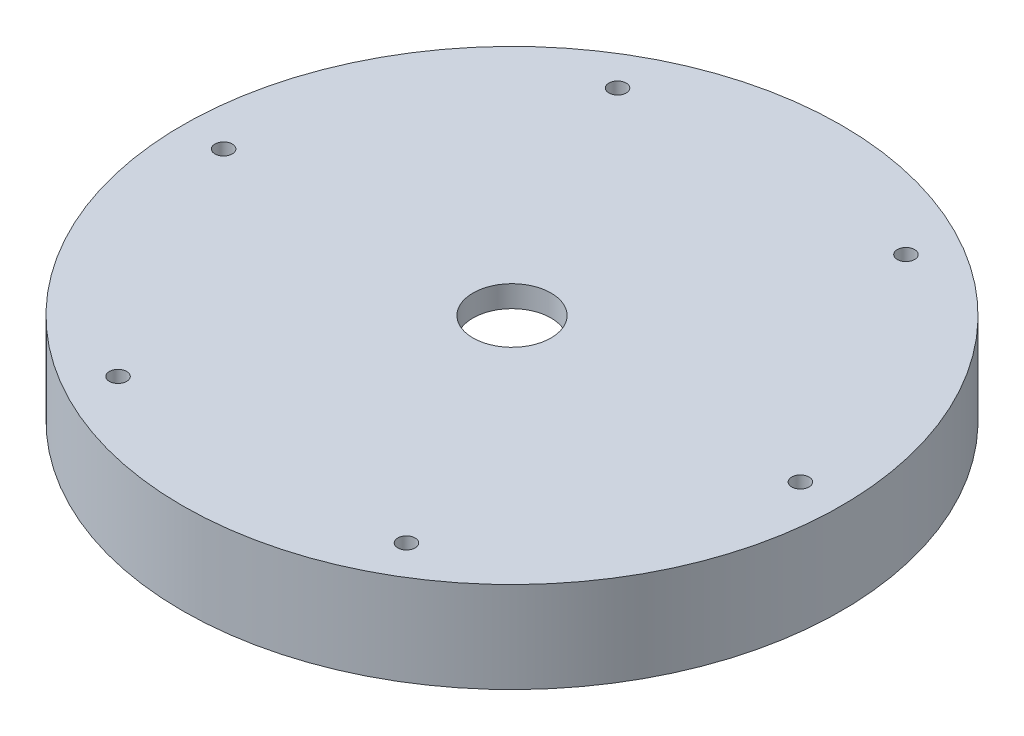
ISO-10303-21;
HEADER;
FILE_DESCRIPTION(('STEP AP214'),'2;1');
FILE_NAME('part.step','',(''),(''),'','','');
FILE_SCHEMA(('AUTOMOTIVE_DESIGN { 1 0 10303 214 1 1 1 1 }'));
ENDSEC;
DATA;
#1=APPLICATION_CONTEXT('core data for automotive mechanical design processes');
#2=APPLICATION_PROTOCOL_DEFINITION('international standard','automotive_design',2000,#1);
#3=PRODUCT_CONTEXT('',#1,'mechanical');
#4=PRODUCT('Part','Part','',(#3));
#5=PRODUCT_RELATED_PRODUCT_CATEGORY('part','',(#4));
#6=PRODUCT_DEFINITION_FORMATION('','',#4);
#7=PRODUCT_DEFINITION_CONTEXT('part definition',#1,'design');
#8=PRODUCT_DEFINITION('design','',#6,#7);
#9=PRODUCT_DEFINITION_SHAPE('','',#8);
#10=(LENGTH_UNIT() NAMED_UNIT(*) SI_UNIT(.MILLI.,.METRE.));
#11=(NAMED_UNIT(*) PLANE_ANGLE_UNIT() SI_UNIT($,.RADIAN.));
#12=(NAMED_UNIT(*) SI_UNIT($,.STERADIAN.) SOLID_ANGLE_UNIT());
#13=UNCERTAINTY_MEASURE_WITH_UNIT(LENGTH_MEASURE(1.E-05),#10,'distance_accuracy_value','');
#14=(GEOMETRIC_REPRESENTATION_CONTEXT(3) GLOBAL_UNCERTAINTY_ASSIGNED_CONTEXT((#13)) GLOBAL_UNIT_ASSIGNED_CONTEXT((#10,
#11,#12)) REPRESENTATION_CONTEXT('',''));
#15=CARTESIAN_POINT('',(0.,0.,0.));
#16=DIRECTION('',(0.,0.,1.));
#17=DIRECTION('',(1.,0.,0.));
#18=AXIS2_PLACEMENT_3D('',#15,#16,#17);
#19=CARTESIAN_POINT('',(0.,38.7086688188191,0.));
#20=DIRECTION('',(0.,1.,0.));
#21=DIRECTION('',(0.,0.,1.));
#22=AXIS2_PLACEMENT_3D('',#19,#20,#21);
#23=CYLINDRICAL_SURFACE('',#22,4.49999999999999);
#24=CARTESIAN_POINT('',(0.,0.,0.));
#25=DIRECTION('',(0.,1.,0.));
#26=DIRECTION('',(0.,0.,1.));
#27=AXIS2_PLACEMENT_3D('',#24,#25,#26);
#28=CIRCLE('',#27,4.49999999999999);
#29=CARTESIAN_POINT('',(0.,0.,4.49999999999999));
#30=VERTEX_POINT('',#29);
#31=EDGE_CURVE('E10',#30,#30,#28,.T.);
#32=ORIENTED_EDGE('',*,*,#31,.T.);
#33=EDGE_LOOP('',(#32));
#34=FACE_BOUND('',#33,.T.);
#35=CARTESIAN_POINT('',(0.,-2.5,0.));
#36=DIRECTION('',(0.,1.,0.));
#37=DIRECTION('',(0.,0.,1.));
#38=AXIS2_PLACEMENT_3D('',#35,#36,#37);
#39=CIRCLE('',#38,4.49999999999999);
#40=CARTESIAN_POINT('',(0.,-2.5,4.49999999999999));
#41=VERTEX_POINT('',#40);
#42=EDGE_CURVE('E65',#41,#41,#39,.T.);
#43=ORIENTED_EDGE('',*,*,#42,.F.);
#44=EDGE_LOOP('',(#43));
#45=FACE_BOUND('',#44,.T.);
#46=ADVANCED_FACE('F37',(#34,#45),#23,.F.);
#47=CARTESIAN_POINT('',(-4.49999999999999,0.,0.));
#48=DIRECTION('',(0.,1.,0.));
#49=DIRECTION('',(0.,0.,1.));
#50=AXIS2_PLACEMENT_3D('',#47,#48,#49);
#51=PLANE('',#50);
#52=CARTESIAN_POINT('',(-33.2875,0.,0.));
#53=DIRECTION('',(0.,-1.,0.));
#54=DIRECTION('',(0.,0.,-1.));
#55=AXIS2_PLACEMENT_3D('',#52,#53,#54);
#56=CIRCLE('',#55,0.999999999999998);
#57=CARTESIAN_POINT('',(-33.2875,0.,-0.999999999999997));
#58=VERTEX_POINT('',#57);
#59=EDGE_CURVE('E68',#58,#58,#56,.T.);
#60=ORIENTED_EDGE('',*,*,#59,.T.);
#61=EDGE_LOOP('',(#60));
#62=FACE_BOUND('',#61,.T.);
#63=CARTESIAN_POINT('',(-16.64375,0.,-28.8278206284745));
#64=DIRECTION('',(0.,-1.,0.));
#65=DIRECTION('',(0.,0.,-1.));
#66=AXIS2_PLACEMENT_3D('',#63,#64,#65);
#67=CIRCLE('',#66,0.999999999999998);
#68=CARTESIAN_POINT('',(-16.64375,0.,-29.8278206284745));
#69=VERTEX_POINT('',#68);
#70=EDGE_CURVE('E95',#69,#69,#67,.T.);
#71=ORIENTED_EDGE('',*,*,#70,.T.);
#72=EDGE_LOOP('',(#71));
#73=FACE_BOUND('',#72,.T.);
#74=CARTESIAN_POINT('',(16.64375,0.,-28.8278206284745));
#75=DIRECTION('',(0.,-1.,0.));
#76=DIRECTION('',(0.,0.,-1.));
#77=AXIS2_PLACEMENT_3D('',#74,#75,#76);
#78=CIRCLE('',#77,0.999999999999998);
#79=CARTESIAN_POINT('',(16.64375,0.,-29.8278206284745));
#80=VERTEX_POINT('',#79);
#81=EDGE_CURVE('E69',#80,#80,#78,.T.);
#82=ORIENTED_EDGE('',*,*,#81,.T.);
#83=EDGE_LOOP('',(#82));
#84=FACE_BOUND('',#83,.T.);
#85=CARTESIAN_POINT('',(33.2875,0.,0.));
#86=DIRECTION('',(0.,-1.,0.));
#87=DIRECTION('',(0.,0.,-1.));
#88=AXIS2_PLACEMENT_3D('',#85,#86,#87);
#89=CIRCLE('',#88,0.999999999999998);
#90=CARTESIAN_POINT('',(33.2875,0.,-0.999999999999995));
#91=VERTEX_POINT('',#90);
#92=EDGE_CURVE('E76',#91,#91,#89,.T.);
#93=ORIENTED_EDGE('',*,*,#92,.T.);
#94=EDGE_LOOP('',(#93));
#95=FACE_BOUND('',#94,.T.);
#96=CARTESIAN_POINT('',(16.64375,0.,28.8278206284745));
#97=DIRECTION('',(0.,-1.,0.));
#98=DIRECTION('',(0.,0.,-1.));
#99=AXIS2_PLACEMENT_3D('',#96,#97,#98);
#100=CIRCLE('',#99,0.999999999999998);
#101=CARTESIAN_POINT('',(16.64375,0.,27.8278206284745));
#102=VERTEX_POINT('',#101);
#103=EDGE_CURVE('E82',#102,#102,#100,.T.);
#104=ORIENTED_EDGE('',*,*,#103,.T.);
#105=EDGE_LOOP('',(#104));
#106=FACE_BOUND('',#105,.T.);
#107=CARTESIAN_POINT('',(-16.64375,0.,28.8278206284745));
#108=DIRECTION('',(0.,-1.,0.));
#109=DIRECTION('',(0.,0.,-1.));
#110=AXIS2_PLACEMENT_3D('',#107,#108,#109);
#111=CIRCLE('',#110,0.999999999999998);
#112=CARTESIAN_POINT('',(-16.64375,0.,27.8278206284745));
#113=VERTEX_POINT('',#112);
#114=EDGE_CURVE('E88',#113,#113,#111,.T.);
#115=ORIENTED_EDGE('',*,*,#114,.T.);
#116=EDGE_LOOP('',(#115));
#117=FACE_BOUND('',#116,.T.);
#118=CARTESIAN_POINT('',(0.,0.,0.));
#119=DIRECTION('',(0.,1.,0.));
#120=DIRECTION('',(0.,0.,1.));
#121=AXIS2_PLACEMENT_3D('',#118,#119,#120);
#122=CIRCLE('',#121,38.0375);
#123=CARTESIAN_POINT('',(0.,0.,38.0375));
#124=VERTEX_POINT('',#123);
#125=EDGE_CURVE('E43',#124,#124,#122,.T.);
#126=ORIENTED_EDGE('',*,*,#125,.T.);
#127=EDGE_LOOP('',(#126));
#128=FACE_BOUND('',#127,.T.);
#129=ORIENTED_EDGE('',*,*,#31,.F.);
#130=EDGE_LOOP('',(#129));
#131=FACE_BOUND('',#130,.T.);
#132=ADVANCED_FACE('F105',(#62,#73,#84,#95,#106,#117,#128,#131),#51,.T.);
#133=CARTESIAN_POINT('',(0.,38.7086688188191,0.));
#134=DIRECTION('',(0.,1.,0.));
#135=DIRECTION('',(0.,0.,1.));
#136=AXIS2_PLACEMENT_3D('',#133,#134,#135);
#137=CYLINDRICAL_SURFACE('',#136,38.0375);
#138=CARTESIAN_POINT('',(0.,-10.5,0.));
#139=DIRECTION('',(0.,1.,0.));
#140=DIRECTION('',(0.,0.,1.));
#141=AXIS2_PLACEMENT_3D('',#138,#139,#140);
#142=CIRCLE('',#141,38.0375);
#143=CARTESIAN_POINT('',(0.,-10.5,38.0375));
#144=VERTEX_POINT('',#143);
#145=EDGE_CURVE('E47',#144,#144,#142,.T.);
#146=ORIENTED_EDGE('',*,*,#145,.T.);
#147=EDGE_LOOP('',(#146));
#148=FACE_BOUND('',#147,.T.);
#149=ORIENTED_EDGE('',*,*,#125,.F.);
#150=EDGE_LOOP('',(#149));
#151=FACE_BOUND('',#150,.T.);
#152=ADVANCED_FACE('F143',(#148,#151),#137,.T.);
#153=CARTESIAN_POINT('',(-35.0375,-10.5,0.));
#154=DIRECTION('',(0.,-1.,0.));
#155=DIRECTION('',(0.,0.,-1.));
#156=AXIS2_PLACEMENT_3D('',#153,#154,#155);
#157=PLANE('',#156);
#158=CARTESIAN_POINT('',(0.,-10.5,0.));
#159=DIRECTION('',(0.,1.,0.));
#160=DIRECTION('',(0.,0.,1.));
#161=AXIS2_PLACEMENT_3D('',#158,#159,#160);
#162=CIRCLE('',#161,35.0375);
#163=CARTESIAN_POINT('',(0.,-10.5,35.0375));
#164=VERTEX_POINT('',#163);
#165=EDGE_CURVE('E51',#164,#164,#162,.T.);
#166=ORIENTED_EDGE('',*,*,#165,.T.);
#167=EDGE_LOOP('',(#166));
#168=FACE_BOUND('',#167,.T.);
#169=ORIENTED_EDGE('',*,*,#145,.F.);
#170=EDGE_LOOP('',(#169));
#171=FACE_BOUND('',#170,.T.);
#172=ADVANCED_FACE('F137',(#168,#171),#157,.T.);
#173=CARTESIAN_POINT('',(0.,38.7086688188191,0.));
#174=DIRECTION('',(0.,1.,0.));
#175=DIRECTION('',(0.,0.,1.));
#176=AXIS2_PLACEMENT_3D('',#173,#174,#175);
#177=CYLINDRICAL_SURFACE('',#176,35.0375);
#178=CARTESIAN_POINT('',(0.,-11.75,0.));
#179=DIRECTION('',(0.,1.,0.));
#180=DIRECTION('',(0.,0.,1.));
#181=AXIS2_PLACEMENT_3D('',#178,#179,#180);
#182=CIRCLE('',#181,35.0375);
#183=CARTESIAN_POINT('',(0.,-11.75,35.0375));
#184=VERTEX_POINT('',#183);
#185=EDGE_CURVE('E56',#184,#184,#182,.T.);
#186=ORIENTED_EDGE('',*,*,#185,.T.);
#187=EDGE_LOOP('',(#186));
#188=FACE_BOUND('',#187,.T.);
#189=ORIENTED_EDGE('',*,*,#165,.F.);
#190=EDGE_LOOP('',(#189));
#191=FACE_BOUND('',#190,.T.);
#192=ADVANCED_FACE('F119',(#188,#191),#177,.T.);
#193=CARTESIAN_POINT('',(-20.,-11.75,0.));
#194=DIRECTION('',(0.,-1.,0.));
#195=DIRECTION('',(0.,0.,-1.));
#196=AXIS2_PLACEMENT_3D('',#193,#194,#195);
#197=PLANE('',#196);
#198=CARTESIAN_POINT('',(-33.2875,-11.75,0.));
#199=DIRECTION('',(0.,-1.,0.));
#200=DIRECTION('',(0.,0.,-1.));
#201=AXIS2_PLACEMENT_3D('',#198,#199,#200);
#202=CIRCLE('',#201,0.999999999999998);
#203=CARTESIAN_POINT('',(-33.2875,-11.75,-0.999999999999997));
#204=VERTEX_POINT('',#203);
#205=EDGE_CURVE('E94',#204,#204,#202,.T.);
#206=ORIENTED_EDGE('',*,*,#205,.F.);
#207=EDGE_LOOP('',(#206));
#208=FACE_BOUND('',#207,.T.);
#209=CARTESIAN_POINT('',(-16.64375,-11.75,-28.8278206284745));
#210=DIRECTION('',(0.,-1.,0.));
#211=DIRECTION('',(0.,0.,-1.));
#212=AXIS2_PLACEMENT_3D('',#209,#210,#211);
#213=CIRCLE('',#212,0.999999999999998);
#214=CARTESIAN_POINT('',(-16.64375,-11.75,-29.8278206284745));
#215=VERTEX_POINT('',#214);
#216=EDGE_CURVE('E73',#215,#215,#213,.T.);
#217=ORIENTED_EDGE('',*,*,#216,.F.);
#218=EDGE_LOOP('',(#217));
#219=FACE_BOUND('',#218,.T.);
#220=CARTESIAN_POINT('',(16.64375,-11.75,-28.8278206284745));
#221=DIRECTION('',(0.,-1.,0.));
#222=DIRECTION('',(0.,0.,-1.));
#223=AXIS2_PLACEMENT_3D('',#220,#221,#222);
#224=CIRCLE('',#223,0.999999999999998);
#225=CARTESIAN_POINT('',(16.64375,-11.75,-29.8278206284745));
#226=VERTEX_POINT('',#225);
#227=EDGE_CURVE('E72',#226,#226,#224,.T.);
#228=ORIENTED_EDGE('',*,*,#227,.F.);
#229=EDGE_LOOP('',(#228));
#230=FACE_BOUND('',#229,.T.);
#231=CARTESIAN_POINT('',(33.2875,-11.75,0.));
#232=DIRECTION('',(0.,-1.,0.));
#233=DIRECTION('',(0.,0.,-1.));
#234=AXIS2_PLACEMENT_3D('',#231,#232,#233);
#235=CIRCLE('',#234,0.999999999999998);
#236=CARTESIAN_POINT('',(33.2875,-11.75,-0.999999999999995));
#237=VERTEX_POINT('',#236);
#238=EDGE_CURVE('E79',#237,#237,#235,.T.);
#239=ORIENTED_EDGE('',*,*,#238,.F.);
#240=EDGE_LOOP('',(#239));
#241=FACE_BOUND('',#240,.T.);
#242=CARTESIAN_POINT('',(16.64375,-11.75,28.8278206284745));
#243=DIRECTION('',(0.,-1.,0.));
#244=DIRECTION('',(0.,0.,-1.));
#245=AXIS2_PLACEMENT_3D('',#242,#243,#244);
#246=CIRCLE('',#245,0.999999999999998);
#247=CARTESIAN_POINT('',(16.64375,-11.75,27.8278206284745));
#248=VERTEX_POINT('',#247);
#249=EDGE_CURVE('E85',#248,#248,#246,.T.);
#250=ORIENTED_EDGE('',*,*,#249,.F.);
#251=EDGE_LOOP('',(#250));
#252=FACE_BOUND('',#251,.T.);
#253=CARTESIAN_POINT('',(-16.64375,-11.75,28.8278206284745));
#254=DIRECTION('',(0.,-1.,0.));
#255=DIRECTION('',(0.,0.,-1.));
#256=AXIS2_PLACEMENT_3D('',#253,#254,#255);
#257=CIRCLE('',#256,0.999999999999998);
#258=CARTESIAN_POINT('',(-16.64375,-11.75,27.8278206284745));
#259=VERTEX_POINT('',#258);
#260=EDGE_CURVE('E91',#259,#259,#257,.T.);
#261=ORIENTED_EDGE('',*,*,#260,.F.);
#262=EDGE_LOOP('',(#261));
#263=FACE_BOUND('',#262,.T.);
#264=CARTESIAN_POINT('',(0.,-11.75,0.));
#265=DIRECTION('',(0.,1.,0.));
#266=DIRECTION('',(0.,0.,1.));
#267=AXIS2_PLACEMENT_3D('',#264,#265,#266);
#268=CIRCLE('',#267,20.);
#269=CARTESIAN_POINT('',(0.,-11.75,20.));
#270=VERTEX_POINT('',#269);
#271=EDGE_CURVE('E59',#270,#270,#268,.T.);
#272=ORIENTED_EDGE('',*,*,#271,.T.);
#273=EDGE_LOOP('',(#272));
#274=FACE_BOUND('',#273,.T.);
#275=ORIENTED_EDGE('',*,*,#185,.F.);
#276=EDGE_LOOP('',(#275));
#277=FACE_BOUND('',#276,.T.);
#278=ADVANCED_FACE('F115',(#208,#219,#230,#241,#252,#263,#274,#277),#197,.T.);
#279=CARTESIAN_POINT('',(0.,38.7086688188191,0.));
#280=DIRECTION('',(0.,1.,0.));
#281=DIRECTION('',(0.,0.,1.));
#282=AXIS2_PLACEMENT_3D('',#279,#280,#281);
#283=CYLINDRICAL_SURFACE('',#282,20.);
#284=CARTESIAN_POINT('',(0.,-2.5,0.));
#285=DIRECTION('',(0.,1.,0.));
#286=DIRECTION('',(0.,0.,1.));
#287=AXIS2_PLACEMENT_3D('',#284,#285,#286);
#288=CIRCLE('',#287,20.);
#289=CARTESIAN_POINT('',(0.,-2.5,20.));
#290=VERTEX_POINT('',#289);
#291=EDGE_CURVE('E62',#290,#290,#288,.T.);
#292=ORIENTED_EDGE('',*,*,#291,.T.);
#293=EDGE_LOOP('',(#292));
#294=FACE_BOUND('',#293,.T.);
#295=ORIENTED_EDGE('',*,*,#271,.F.);
#296=EDGE_LOOP('',(#295));
#297=FACE_BOUND('',#296,.T.);
#298=ADVANCED_FACE('F118',(#294,#297),#283,.F.);
#299=CARTESIAN_POINT('',(-20.,-2.5,0.));
#300=DIRECTION('',(0.,-1.,0.));
#301=DIRECTION('',(0.,0.,-1.));
#302=AXIS2_PLACEMENT_3D('',#299,#300,#301);
#303=PLANE('',#302);
#304=ORIENTED_EDGE('',*,*,#42,.T.);
#305=EDGE_LOOP('',(#304));
#306=FACE_BOUND('',#305,.T.);
#307=ORIENTED_EDGE('',*,*,#291,.F.);
#308=EDGE_LOOP('',(#307));
#309=FACE_BOUND('',#308,.T.);
#310=ADVANCED_FACE('F159',(#306,#309),#303,.T.);
#311=CARTESIAN_POINT('',(-16.64375,0.,28.8278206284745));
#312=DIRECTION('',(0.,-1.,0.));
#313=DIRECTION('',(0.,0.,-1.));
#314=AXIS2_PLACEMENT_3D('',#311,#312,#313);
#315=CYLINDRICAL_SURFACE('',#314,0.999999999999998);
#316=ORIENTED_EDGE('',*,*,#114,.F.);
#317=EDGE_LOOP('',(#316));
#318=FACE_BOUND('',#317,.T.);
#319=ORIENTED_EDGE('',*,*,#260,.T.);
#320=EDGE_LOOP('',(#319));
#321=FACE_BOUND('',#320,.T.);
#322=ADVANCED_FACE('F162',(#318,#321),#315,.F.);
#323=CARTESIAN_POINT('',(16.64375,0.,28.8278206284745));
#324=DIRECTION('',(0.,-1.,0.));
#325=DIRECTION('',(0.,0.,-1.));
#326=AXIS2_PLACEMENT_3D('',#323,#324,#325);
#327=CYLINDRICAL_SURFACE('',#326,0.999999999999998);
#328=ORIENTED_EDGE('',*,*,#103,.F.);
#329=EDGE_LOOP('',(#328));
#330=FACE_BOUND('',#329,.T.);
#331=ORIENTED_EDGE('',*,*,#249,.T.);
#332=EDGE_LOOP('',(#331));
#333=FACE_BOUND('',#332,.T.);
#334=ADVANCED_FACE('F179',(#330,#333),#327,.F.);
#335=CARTESIAN_POINT('',(33.2875,0.,0.));
#336=DIRECTION('',(0.,-1.,0.));
#337=DIRECTION('',(0.,0.,-1.));
#338=AXIS2_PLACEMENT_3D('',#335,#336,#337);
#339=CYLINDRICAL_SURFACE('',#338,0.999999999999998);
#340=ORIENTED_EDGE('',*,*,#92,.F.);
#341=EDGE_LOOP('',(#340));
#342=FACE_BOUND('',#341,.T.);
#343=ORIENTED_EDGE('',*,*,#238,.T.);
#344=EDGE_LOOP('',(#343));
#345=FACE_BOUND('',#344,.T.);
#346=ADVANCED_FACE('F175',(#342,#345),#339,.F.);
#347=CARTESIAN_POINT('',(16.64375,0.,-28.8278206284745));
#348=DIRECTION('',(0.,-1.,0.));
#349=DIRECTION('',(0.,0.,-1.));
#350=AXIS2_PLACEMENT_3D('',#347,#348,#349);
#351=CYLINDRICAL_SURFACE('',#350,0.999999999999998);
#352=ORIENTED_EDGE('',*,*,#81,.F.);
#353=EDGE_LOOP('',(#352));
#354=FACE_BOUND('',#353,.T.);
#355=ORIENTED_EDGE('',*,*,#227,.T.);
#356=EDGE_LOOP('',(#355));
#357=FACE_BOUND('',#356,.T.);
#358=ADVANCED_FACE('F172',(#354,#357),#351,.F.);
#359=CARTESIAN_POINT('',(-16.64375,0.,-28.8278206284745));
#360=DIRECTION('',(0.,-1.,0.));
#361=DIRECTION('',(0.,0.,-1.));
#362=AXIS2_PLACEMENT_3D('',#359,#360,#361);
#363=CYLINDRICAL_SURFACE('',#362,0.999999999999998);
#364=ORIENTED_EDGE('',*,*,#70,.F.);
#365=EDGE_LOOP('',(#364));
#366=FACE_BOUND('',#365,.T.);
#367=ORIENTED_EDGE('',*,*,#216,.T.);
#368=EDGE_LOOP('',(#367));
#369=FACE_BOUND('',#368,.T.);
#370=ADVANCED_FACE('F111',(#366,#369),#363,.F.);
#371=CARTESIAN_POINT('',(-33.2875,0.,0.));
#372=DIRECTION('',(0.,-1.,0.));
#373=DIRECTION('',(0.,0.,-1.));
#374=AXIS2_PLACEMENT_3D('',#371,#372,#373);
#375=CYLINDRICAL_SURFACE('',#374,0.999999999999998);
#376=ORIENTED_EDGE('',*,*,#59,.F.);
#377=EDGE_LOOP('',(#376));
#378=FACE_BOUND('',#377,.T.);
#379=ORIENTED_EDGE('',*,*,#205,.T.);
#380=EDGE_LOOP('',(#379));
#381=FACE_BOUND('',#380,.T.);
#382=ADVANCED_FACE('F108',(#378,#381),#375,.F.);
#383=CLOSED_SHELL('',(#46,#132,#152,#172,#192,#278,#298,#310,#322,#334,#346,#358,#370,#382));
#384=MANIFOLD_SOLID_BREP('B2',#383);
#385=ADVANCED_BREP_SHAPE_REPRESENTATION('',(#18,#384),#14);
#386=SHAPE_DEFINITION_REPRESENTATION(#9,#385);
ENDSEC;
END-ISO-10303-21;
